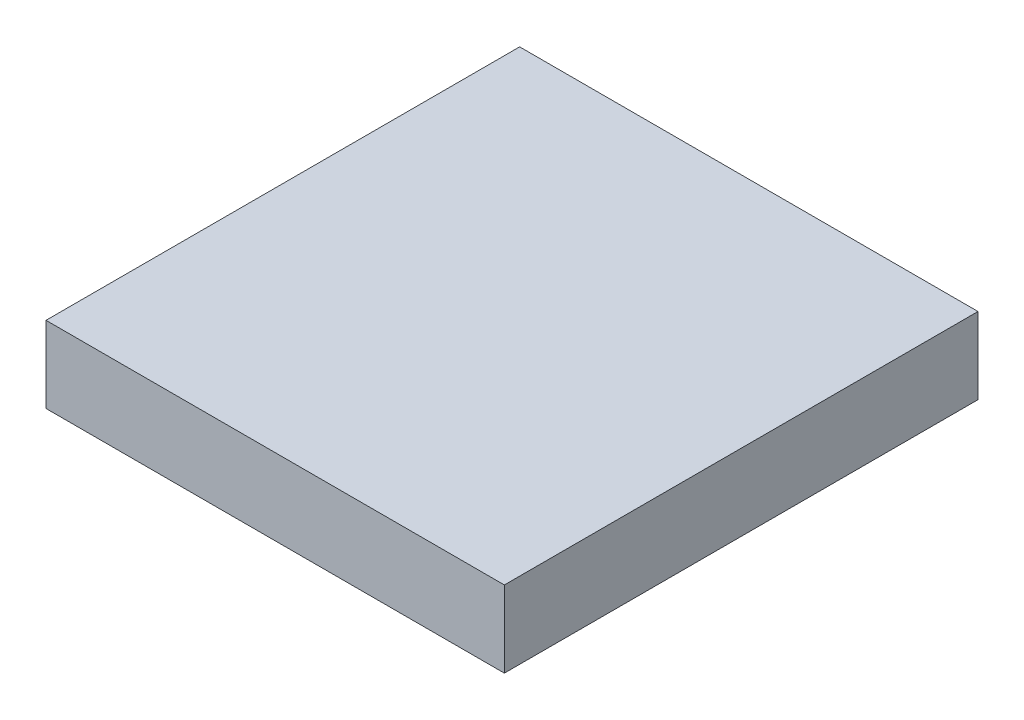
ISO-10303-21;
HEADER;
FILE_DESCRIPTION(('STEP AP214'),'2;1');
FILE_NAME('part.step','',(''),(''),'','','');
FILE_SCHEMA(('AUTOMOTIVE_DESIGN { 1 0 10303 214 1 1 1 1 }'));
ENDSEC;
DATA;
#1=APPLICATION_CONTEXT('core data for automotive mechanical design processes');
#2=APPLICATION_PROTOCOL_DEFINITION('international standard','automotive_design',2000,#1);
#3=PRODUCT_CONTEXT('',#1,'mechanical');
#4=PRODUCT('Part','Part','',(#3));
#5=PRODUCT_RELATED_PRODUCT_CATEGORY('part','',(#4));
#6=PRODUCT_DEFINITION_FORMATION('','',#4);
#7=PRODUCT_DEFINITION_CONTEXT('part definition',#1,'design');
#8=PRODUCT_DEFINITION('design','',#6,#7);
#9=PRODUCT_DEFINITION_SHAPE('','',#8);
#10=(LENGTH_UNIT() NAMED_UNIT(*) SI_UNIT(.MILLI.,.METRE.));
#11=(NAMED_UNIT(*) PLANE_ANGLE_UNIT() SI_UNIT($,.RADIAN.));
#12=(NAMED_UNIT(*) SI_UNIT($,.STERADIAN.) SOLID_ANGLE_UNIT());
#13=UNCERTAINTY_MEASURE_WITH_UNIT(LENGTH_MEASURE(1.E-05),#10,'distance_accuracy_value','');
#14=(GEOMETRIC_REPRESENTATION_CONTEXT(3) GLOBAL_UNCERTAINTY_ASSIGNED_CONTEXT((#13)) GLOBAL_UNIT_ASSIGNED_CONTEXT((#10,
#11,#12)) REPRESENTATION_CONTEXT('',''));
#15=CARTESIAN_POINT('',(0.,0.,0.));
#16=DIRECTION('',(0.,0.,1.));
#17=DIRECTION('',(1.,0.,0.));
#18=AXIS2_PLACEMENT_3D('',#15,#16,#17);
#19=CARTESIAN_POINT('',(19.05,6.35,-19.685));
#20=DIRECTION('',(-1.,0.,0.));
#21=DIRECTION('',(0.,0.,1.));
#22=AXIS2_PLACEMENT_3D('',#19,#20,#21);
#23=PLANE('',#22);
#24=DIRECTION('',(0.,0.,-1.));
#25=VECTOR('',#24,1.);
#26=CARTESIAN_POINT('',(19.05,0.,-19.685));
#27=LINE('',#26,#25);
#28=CARTESIAN_POINT('',(19.05,0.,19.685));
#29=VERTEX_POINT('',#28);
#30=CARTESIAN_POINT('',(19.05,0.,-19.685));
#31=VERTEX_POINT('',#30);
#32=EDGE_CURVE('E101',#29,#31,#27,.T.);
#33=ORIENTED_EDGE('',*,*,#32,.T.);
#34=DIRECTION('',(0.,-1.,0.));
#35=VECTOR('',#34,1.);
#36=CARTESIAN_POINT('',(19.05,6.35,-19.685));
#37=LINE('',#36,#35);
#38=CARTESIAN_POINT('',(19.05,6.35,-19.685));
#39=VERTEX_POINT('',#38);
#40=EDGE_CURVE('E11',#39,#31,#37,.T.);
#41=ORIENTED_EDGE('',*,*,#40,.F.);
#42=DIRECTION('',(0.,0.,-1.));
#43=VECTOR('',#42,1.);
#44=CARTESIAN_POINT('',(19.05,6.35,-19.685));
#45=LINE('',#44,#43);
#46=CARTESIAN_POINT('',(19.05,6.35,19.685));
#47=VERTEX_POINT('',#46);
#48=EDGE_CURVE('E95',#47,#39,#45,.T.);
#49=ORIENTED_EDGE('',*,*,#48,.F.);
#50=DIRECTION('',(0.,-1.,0.));
#51=VECTOR('',#50,1.);
#52=CARTESIAN_POINT('',(19.05,6.35,19.685));
#53=LINE('',#52,#51);
#54=EDGE_CURVE('E99',#47,#29,#53,.T.);
#55=ORIENTED_EDGE('',*,*,#54,.T.);
#56=EDGE_LOOP('',(#33,#41,#49,#55));
#57=FACE_BOUND('',#56,.T.);
#58=ADVANCED_FACE('F41',(#57),#23,.F.);
#59=CARTESIAN_POINT('',(-19.05,6.35,-19.685));
#60=DIRECTION('',(0.,0.,1.));
#61=DIRECTION('',(1.,0.,0.));
#62=AXIS2_PLACEMENT_3D('',#59,#60,#61);
#63=PLANE('',#62);
#64=DIRECTION('',(-1.,0.,0.));
#65=VECTOR('',#64,1.);
#66=CARTESIAN_POINT('',(-19.05,0.,-19.685));
#67=LINE('',#66,#65);
#68=CARTESIAN_POINT('',(-19.05,0.,-19.685));
#69=VERTEX_POINT('',#68);
#70=EDGE_CURVE('E96',#31,#69,#67,.T.);
#71=ORIENTED_EDGE('',*,*,#70,.T.);
#72=DIRECTION('',(0.,-1.,0.));
#73=VECTOR('',#72,1.);
#74=CARTESIAN_POINT('',(-19.05,6.35,-19.685));
#75=LINE('',#74,#73);
#76=CARTESIAN_POINT('',(-19.05,6.35,-19.685));
#77=VERTEX_POINT('',#76);
#78=EDGE_CURVE('E47',#77,#69,#75,.T.);
#79=ORIENTED_EDGE('',*,*,#78,.F.);
#80=DIRECTION('',(-1.,0.,0.));
#81=VECTOR('',#80,1.);
#82=CARTESIAN_POINT('',(-19.05,6.35,-19.685));
#83=LINE('',#82,#81);
#84=EDGE_CURVE('E90',#39,#77,#83,.T.);
#85=ORIENTED_EDGE('',*,*,#84,.F.);
#86=ORIENTED_EDGE('',*,*,#40,.T.);
#87=EDGE_LOOP('',(#71,#79,#85,#86));
#88=FACE_BOUND('',#87,.T.);
#89=ADVANCED_FACE('F94',(#88),#63,.F.);
#90=CARTESIAN_POINT('',(-19.05,6.35,-19.685));
#91=DIRECTION('',(1.,0.,0.));
#92=DIRECTION('',(0.,0.,-1.));
#93=AXIS2_PLACEMENT_3D('',#90,#91,#92);
#94=PLANE('',#93);
#95=DIRECTION('',(0.,0.,1.));
#96=VECTOR('',#95,1.);
#97=CARTESIAN_POINT('',(-19.05,0.,-19.685));
#98=LINE('',#97,#96);
#99=CARTESIAN_POINT('',(-19.05,0.,19.685));
#100=VERTEX_POINT('',#99);
#101=EDGE_CURVE('E74',#69,#100,#98,.T.);
#102=ORIENTED_EDGE('',*,*,#101,.T.);
#103=DIRECTION('',(0.,-1.,0.));
#104=VECTOR('',#103,1.);
#105=CARTESIAN_POINT('',(-19.05,6.35,19.685));
#106=LINE('',#105,#104);
#107=CARTESIAN_POINT('',(-19.05,6.35,19.685));
#108=VERTEX_POINT('',#107);
#109=EDGE_CURVE('E100',#108,#100,#106,.T.);
#110=ORIENTED_EDGE('',*,*,#109,.F.);
#111=DIRECTION('',(0.,0.,1.));
#112=VECTOR('',#111,1.);
#113=CARTESIAN_POINT('',(-19.05,6.35,-19.685));
#114=LINE('',#113,#112);
#115=EDGE_CURVE('E89',#77,#108,#114,.T.);
#116=ORIENTED_EDGE('',*,*,#115,.F.);
#117=ORIENTED_EDGE('',*,*,#78,.T.);
#118=EDGE_LOOP('',(#102,#110,#116,#117));
#119=FACE_BOUND('',#118,.T.);
#120=ADVANCED_FACE('F97',(#119),#94,.F.);
#121=CARTESIAN_POINT('',(-19.05,6.35,19.685));
#122=DIRECTION('',(0.,0.,-1.));
#123=DIRECTION('',(-1.,0.,0.));
#124=AXIS2_PLACEMENT_3D('',#121,#122,#123);
#125=PLANE('',#124);
#126=DIRECTION('',(1.,0.,0.));
#127=VECTOR('',#126,1.);
#128=CARTESIAN_POINT('',(-19.05,0.,19.685));
#129=LINE('',#128,#127);
#130=EDGE_CURVE('E79',#100,#29,#129,.T.);
#131=ORIENTED_EDGE('',*,*,#130,.T.);
#132=ORIENTED_EDGE('',*,*,#54,.F.);
#133=DIRECTION('',(1.,0.,0.));
#134=VECTOR('',#133,1.);
#135=CARTESIAN_POINT('',(-19.05,6.35,19.685));
#136=LINE('',#135,#134);
#137=EDGE_CURVE('E60',#108,#47,#136,.T.);
#138=ORIENTED_EDGE('',*,*,#137,.F.);
#139=ORIENTED_EDGE('',*,*,#109,.T.);
#140=EDGE_LOOP('',(#131,#132,#138,#139));
#141=FACE_BOUND('',#140,.T.);
#142=ADVANCED_FACE('F112',(#141),#125,.F.);
#143=CARTESIAN_POINT('',(0.,6.35,0.));
#144=DIRECTION('',(0.,1.,0.));
#145=DIRECTION('',(0.,0.,1.));
#146=AXIS2_PLACEMENT_3D('',#143,#144,#145);
#147=PLANE('',#146);
#148=ORIENTED_EDGE('',*,*,#48,.T.);
#149=ORIENTED_EDGE('',*,*,#84,.T.);
#150=ORIENTED_EDGE('',*,*,#115,.T.);
#151=ORIENTED_EDGE('',*,*,#137,.T.);
#152=EDGE_LOOP('',(#148,#149,#150,#151));
#153=FACE_BOUND('',#152,.T.);
#154=ADVANCED_FACE('F88',(#153),#147,.T.);
#155=CARTESIAN_POINT('',(0.,0.,0.));
#156=DIRECTION('',(0.,1.,0.));
#157=DIRECTION('',(0.,0.,1.));
#158=AXIS2_PLACEMENT_3D('',#155,#156,#157);
#159=PLANE('',#158);
#160=ORIENTED_EDGE('',*,*,#32,.F.);
#161=ORIENTED_EDGE('',*,*,#130,.F.);
#162=ORIENTED_EDGE('',*,*,#101,.F.);
#163=ORIENTED_EDGE('',*,*,#70,.F.);
#164=EDGE_LOOP('',(#160,#161,#162,#163));
#165=FACE_BOUND('',#164,.T.);
#166=ADVANCED_FACE('F114',(#165),#159,.F.);
#167=CLOSED_SHELL('',(#58,#89,#120,#142,#154,#166));
#168=MANIFOLD_SOLID_BREP('B2',#167);
#169=ADVANCED_BREP_SHAPE_REPRESENTATION('',(#18,#168),#14);
#170=SHAPE_DEFINITION_REPRESENTATION(#9,#169);
ENDSEC;
END-ISO-10303-21;
